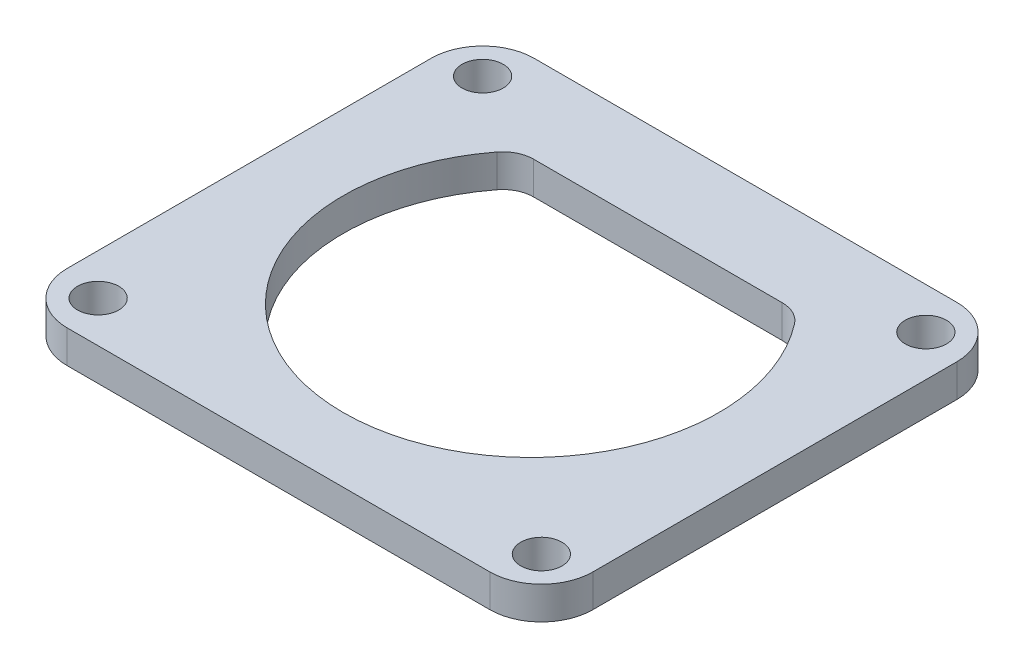
ISO-10303-21;
HEADER;
FILE_DESCRIPTION(('STEP AP214'),'2;1');
FILE_NAME('part.step','',(''),(''),'','','');
FILE_SCHEMA(('AUTOMOTIVE_DESIGN { 1 0 10303 214 1 1 1 1 }'));
ENDSEC;
DATA;
#1=APPLICATION_CONTEXT('core data for automotive mechanical design processes');
#2=APPLICATION_PROTOCOL_DEFINITION('international standard','automotive_design',2000,#1);
#3=PRODUCT_CONTEXT('',#1,'mechanical');
#4=PRODUCT('Part','Part','',(#3));
#5=PRODUCT_RELATED_PRODUCT_CATEGORY('part','',(#4));
#6=PRODUCT_DEFINITION_FORMATION('','',#4);
#7=PRODUCT_DEFINITION_CONTEXT('part definition',#1,'design');
#8=PRODUCT_DEFINITION('design','',#6,#7);
#9=PRODUCT_DEFINITION_SHAPE('','',#8);
#10=(LENGTH_UNIT() NAMED_UNIT(*) SI_UNIT(.MILLI.,.METRE.));
#11=(NAMED_UNIT(*) PLANE_ANGLE_UNIT() SI_UNIT($,.RADIAN.));
#12=(NAMED_UNIT(*) SI_UNIT($,.STERADIAN.) SOLID_ANGLE_UNIT());
#13=UNCERTAINTY_MEASURE_WITH_UNIT(LENGTH_MEASURE(1.E-05),#10,'distance_accuracy_value','');
#14=(GEOMETRIC_REPRESENTATION_CONTEXT(3) GLOBAL_UNCERTAINTY_ASSIGNED_CONTEXT((#13)) GLOBAL_UNIT_ASSIGNED_CONTEXT((#10,
#11,#12)) REPRESENTATION_CONTEXT('',''));
#15=CARTESIAN_POINT('',(0.,0.,0.));
#16=DIRECTION('',(0.,0.,1.));
#17=DIRECTION('',(1.,0.,0.));
#18=AXIS2_PLACEMENT_3D('',#15,#16,#17);
#19=CARTESIAN_POINT('',(-823.489347611488,375.510927831157,291.45));
#20=DIRECTION('',(0.,-1.,0.));
#21=DIRECTION('',(0.,0.,-1.));
#22=AXIS2_PLACEMENT_3D('',#19,#20,#21);
#23=PLANE('',#22);
#24=CARTESIAN_POINT('',(-782.489347611488,375.510927831157,363.05));
#25=DIRECTION('',(0.,1.,0.));
#26=DIRECTION('',(0.,0.,1.));
#27=AXIS2_PLACEMENT_3D('',#24,#25,#26);
#28=CIRCLE('',#27,10.);
#29=CARTESIAN_POINT('',(-772.489347611488,375.510927831157,363.05));
#30=VERTEX_POINT('',#29);
#31=CARTESIAN_POINT('',(-782.489347611488,375.510927831157,373.05));
#32=VERTEX_POINT('',#31);
#33=EDGE_CURVE('E196',#30,#32,#28,.F.);
#34=ORIENTED_EDGE('',*,*,#33,.F.);
#35=DIRECTION('',(0.,0.,1.));
#36=VECTOR('',#35,1.);
#37=CARTESIAN_POINT('',(-772.489347611488,375.510927831157,375.05));
#38=LINE('',#37,#36);
#39=CARTESIAN_POINT('',(-772.489347611488,375.510927831157,292.45));
#40=VERTEX_POINT('',#39);
#41=EDGE_CURVE('E135',#30,#40,#38,.F.);
#42=ORIENTED_EDGE('',*,*,#41,.T.);
#43=CARTESIAN_POINT('',(-782.489347611488,375.510927831157,292.45));
#44=DIRECTION('',(0.,-1.,0.));
#45=DIRECTION('',(0.,0.,-1.));
#46=AXIS2_PLACEMENT_3D('',#43,#44,#45);
#47=CIRCLE('',#46,10.);
#48=CARTESIAN_POINT('',(-782.489347611488,375.510927831157,282.45));
#49=VERTEX_POINT('',#48);
#50=EDGE_CURVE('E139',#49,#40,#47,.T.);
#51=ORIENTED_EDGE('',*,*,#50,.F.);
#52=DIRECTION('',(-1.,0.,0.));
#53=VECTOR('',#52,1.);
#54=CARTESIAN_POINT('',(-823.489347611488,375.510927831157,282.45));
#55=LINE('',#54,#53);
#56=CARTESIAN_POINT('',(-864.489347611488,375.510927831157,282.45));
#57=VERTEX_POINT('',#56);
#58=EDGE_CURVE('E145',#57,#49,#55,.F.);
#59=ORIENTED_EDGE('',*,*,#58,.F.);
#60=CARTESIAN_POINT('',(-864.489347611488,375.510927831157,292.45));
#61=DIRECTION('',(0.,1.,0.));
#62=DIRECTION('',(0.,0.,1.));
#63=AXIS2_PLACEMENT_3D('',#60,#61,#62);
#64=CIRCLE('',#63,10.);
#65=CARTESIAN_POINT('',(-874.489347611488,375.510927831157,292.45));
#66=VERTEX_POINT('',#65);
#67=EDGE_CURVE('E203',#66,#57,#64,.F.);
#68=ORIENTED_EDGE('',*,*,#67,.F.);
#69=DIRECTION('',(0.,0.,-1.));
#70=VECTOR('',#69,1.);
#71=CARTESIAN_POINT('',(-874.489347611488,375.510927831157,283.45));
#72=LINE('',#71,#70);
#73=CARTESIAN_POINT('',(-874.489347611488,375.510927831157,363.05));
#74=VERTEX_POINT('',#73);
#75=EDGE_CURVE('E150',#66,#74,#72,.F.);
#76=ORIENTED_EDGE('',*,*,#75,.T.);
#77=CARTESIAN_POINT('',(-864.489347611488,375.510927831157,363.05));
#78=DIRECTION('',(0.,-1.,0.));
#79=DIRECTION('',(0.,0.,-1.));
#80=AXIS2_PLACEMENT_3D('',#77,#78,#79);
#81=CIRCLE('',#80,10.);
#82=CARTESIAN_POINT('',(-864.489347611488,375.510927831157,373.05));
#83=VERTEX_POINT('',#82);
#84=EDGE_CURVE('E153',#83,#74,#81,.T.);
#85=ORIENTED_EDGE('',*,*,#84,.F.);
#86=DIRECTION('',(-1.,0.,0.));
#87=VECTOR('',#86,1.);
#88=CARTESIAN_POINT('',(-869.489347611488,375.510927831157,373.05));
#89=LINE('',#88,#87);
#90=EDGE_CURVE('E140',#83,#32,#89,.F.);
#91=ORIENTED_EDGE('',*,*,#90,.T.);
#92=EDGE_LOOP('',(#34,#42,#51,#59,#68,#76,#85,#91));
#93=FACE_BOUND('',#92,.T.);
#94=CARTESIAN_POINT('',(-866.489347611488,375.510927831157,365.05));
#95=DIRECTION('',(0.,-1.,0.));
#96=DIRECTION('',(0.,0.,-1.));
#97=AXIS2_PLACEMENT_3D('',#94,#95,#96);
#98=CIRCLE('',#97,4.);
#99=CARTESIAN_POINT('',(-866.489347611488,375.510927831157,361.05));
#100=VERTEX_POINT('',#99);
#101=EDGE_CURVE('E217',#100,#100,#98,.T.);
#102=ORIENTED_EDGE('',*,*,#101,.T.);
#103=EDGE_LOOP('',(#102));
#104=FACE_BOUND('',#103,.T.);
#105=CARTESIAN_POINT('',(-866.489347611488,375.510927831157,290.45));
#106=DIRECTION('',(0.,-1.,0.));
#107=DIRECTION('',(0.,0.,-1.));
#108=AXIS2_PLACEMENT_3D('',#105,#106,#107);
#109=CIRCLE('',#108,4.);
#110=CARTESIAN_POINT('',(-866.489347611488,375.510927831157,286.45));
#111=VERTEX_POINT('',#110);
#112=EDGE_CURVE('E221',#111,#111,#109,.T.);
#113=ORIENTED_EDGE('',*,*,#112,.T.);
#114=EDGE_LOOP('',(#113));
#115=FACE_BOUND('',#114,.T.);
#116=CARTESIAN_POINT('',(-780.489347611488,375.510927831157,365.05));
#117=DIRECTION('',(0.,-1.,0.));
#118=DIRECTION('',(0.,0.,-1.));
#119=AXIS2_PLACEMENT_3D('',#116,#117,#118);
#120=CIRCLE('',#119,4.);
#121=CARTESIAN_POINT('',(-780.489347611488,375.510927831157,361.05));
#122=VERTEX_POINT('',#121);
#123=EDGE_CURVE('E213',#122,#122,#120,.T.);
#124=ORIENTED_EDGE('',*,*,#123,.T.);
#125=EDGE_LOOP('',(#124));
#126=FACE_BOUND('',#125,.T.);
#127=CARTESIAN_POINT('',(-780.489347611488,375.510927831157,290.45));
#128=DIRECTION('',(0.,-1.,0.));
#129=DIRECTION('',(0.,0.,-1.));
#130=AXIS2_PLACEMENT_3D('',#127,#128,#129);
#131=CIRCLE('',#130,4.);
#132=CARTESIAN_POINT('',(-780.489347611488,375.510927831157,286.45));
#133=VERTEX_POINT('',#132);
#134=EDGE_CURVE('E144',#133,#133,#131,.T.);
#135=ORIENTED_EDGE('',*,*,#134,.T.);
#136=EDGE_LOOP('',(#135));
#137=FACE_BOUND('',#136,.T.);
#138=CARTESIAN_POINT('',(-847.597055943057,375.510927831157,305.45));
#139=DIRECTION('',(0.,1.,0.));
#140=DIRECTION('',(0.,0.,1.));
#141=AXIS2_PLACEMENT_3D('',#138,#139,#140);
#142=CIRCLE('',#141,6.);
#143=CARTESIAN_POINT('',(-852.347499307023,375.510927831157,301.784855003448));
#144=VERTEX_POINT('',#143);
#145=CARTESIAN_POINT('',(-847.597055943057,375.510927831157,299.45));
#146=VERTEX_POINT('',#145);
#147=EDGE_CURVE('E19',#144,#146,#142,.F.);
#148=ORIENTED_EDGE('',*,*,#147,.T.);
#149=DIRECTION('',(-1.,0.,0.));
#150=VECTOR('',#149,1.);
#151=CARTESIAN_POINT('',(-854.928096316012,375.510927831157,299.45));
#152=LINE('',#151,#150);
#153=CARTESIAN_POINT('',(-799.381639279919,375.510927831157,299.45));
#154=VERTEX_POINT('',#153);
#155=EDGE_CURVE('E106',#146,#154,#152,.F.);
#156=ORIENTED_EDGE('',*,*,#155,.T.);
#157=CARTESIAN_POINT('',(-799.381639279919,375.510927831157,305.45));
#158=DIRECTION('',(0.,1.,0.));
#159=DIRECTION('',(0.,0.,1.));
#160=AXIS2_PLACEMENT_3D('',#157,#158,#159);
#161=CIRCLE('',#160,6.);
#162=CARTESIAN_POINT('',(-794.631195915953,375.510927831157,301.784855003448));
#163=VERTEX_POINT('',#162);
#164=EDGE_CURVE('E225',#154,#163,#161,.F.);
#165=ORIENTED_EDGE('',*,*,#164,.T.);
#166=CARTESIAN_POINT('',(-823.489347611488,375.510927831157,324.05));
#167=DIRECTION('',(0.,1.,0.));
#168=DIRECTION('',(0.,0.,1.));
#169=AXIS2_PLACEMENT_3D('',#166,#167,#168);
#170=CIRCLE('',#169,36.449);
#171=EDGE_CURVE('E103',#163,#144,#170,.F.);
#172=ORIENTED_EDGE('',*,*,#171,.T.);
#173=EDGE_LOOP('',(#148,#156,#165,#172));
#174=FACE_BOUND('',#173,.T.);
#175=ADVANCED_FACE('F16',(#93,#104,#115,#126,#137,#174),#23,.F.);
#176=CARTESIAN_POINT('',(-854.928096316012,369.160927831157,299.45));
#177=DIRECTION('',(0.,0.,-1.));
#178=DIRECTION('',(-1.,0.,0.));
#179=AXIS2_PLACEMENT_3D('',#176,#177,#178);
#180=PLANE('',#179);
#181=ORIENTED_EDGE('',*,*,#155,.F.);
#182=DIRECTION('',(0.,1.,0.));
#183=VECTOR('',#182,1.);
#184=CARTESIAN_POINT('',(-847.597055943057,368.525925431157,299.45));
#185=LINE('',#184,#183);
#186=CARTESIAN_POINT('',(-847.597055943057,369.160927831157,299.45));
#187=VERTEX_POINT('',#186);
#188=EDGE_CURVE('E112',#146,#187,#185,.F.);
#189=ORIENTED_EDGE('',*,*,#188,.T.);
#190=DIRECTION('',(1.,0.,0.));
#191=VECTOR('',#190,1.);
#192=CARTESIAN_POINT('',(-823.489347611488,369.160927831157,299.45));
#193=LINE('',#192,#191);
#194=CARTESIAN_POINT('',(-799.381639279919,369.160927831157,299.45));
#195=VERTEX_POINT('',#194);
#196=EDGE_CURVE('E195',#195,#187,#193,.F.);
#197=ORIENTED_EDGE('',*,*,#196,.F.);
#198=DIRECTION('',(0.,1.,0.));
#199=VECTOR('',#198,1.);
#200=CARTESIAN_POINT('',(-799.381639279919,368.525925431157,299.45));
#201=LINE('',#200,#199);
#202=EDGE_CURVE('E117',#195,#154,#201,.T.);
#203=ORIENTED_EDGE('',*,*,#202,.T.);
#204=EDGE_LOOP('',(#181,#189,#197,#203));
#205=FACE_BOUND('',#204,.T.);
#206=ADVANCED_FACE('F114',(#205),#180,.F.);
#207=CARTESIAN_POINT('',(-847.597055943057,368.525925431157,305.45));
#208=DIRECTION('',(0.,1.,0.));
#209=DIRECTION('',(0.,0.,1.));
#210=AXIS2_PLACEMENT_3D('',#207,#208,#209);
#211=CYLINDRICAL_SURFACE('',#210,6.);
#212=CARTESIAN_POINT('',(-847.597055943057,369.160927831157,305.45));
#213=DIRECTION('',(0.,1.,0.));
#214=DIRECTION('',(0.,0.,1.));
#215=AXIS2_PLACEMENT_3D('',#212,#213,#214);
#216=CIRCLE('',#215,6.);
#217=CARTESIAN_POINT('',(-852.347499307023,369.160927831157,301.784855003448));
#218=VERTEX_POINT('',#217);
#219=EDGE_CURVE('E123',#187,#218,#216,.T.);
#220=ORIENTED_EDGE('',*,*,#219,.F.);
#221=ORIENTED_EDGE('',*,*,#188,.F.);
#222=ORIENTED_EDGE('',*,*,#147,.F.);
#223=DIRECTION('',(0.,1.,0.));
#224=VECTOR('',#223,1.);
#225=CARTESIAN_POINT('',(-852.347499307023,368.525925431157,301.784855003448));
#226=LINE('',#225,#224);
#227=EDGE_CURVE('E131',#144,#218,#226,.F.);
#228=ORIENTED_EDGE('',*,*,#227,.T.);
#229=EDGE_LOOP('',(#220,#221,#222,#228));
#230=FACE_BOUND('',#229,.T.);
#231=ADVANCED_FACE('F121',(#230),#211,.F.);
#232=CARTESIAN_POINT('',(-823.489347611488,368.525925431157,324.05));
#233=DIRECTION('',(0.,1.,0.));
#234=DIRECTION('',(0.,0.,1.));
#235=AXIS2_PLACEMENT_3D('',#232,#233,#234);
#236=CYLINDRICAL_SURFACE('',#235,36.449);
#237=ORIENTED_EDGE('',*,*,#171,.F.);
#238=DIRECTION('',(0.,1.,0.));
#239=VECTOR('',#238,1.);
#240=CARTESIAN_POINT('',(-794.631195915953,368.525925431157,301.784855003448));
#241=LINE('',#240,#239);
#242=CARTESIAN_POINT('',(-794.631195915953,369.160927831157,301.784855003448));
#243=VERTEX_POINT('',#242);
#244=EDGE_CURVE('E227',#163,#243,#241,.F.);
#245=ORIENTED_EDGE('',*,*,#244,.T.);
#246=CARTESIAN_POINT('',(-823.489347611488,369.160927831157,324.05));
#247=DIRECTION('',(0.,1.,0.));
#248=DIRECTION('',(0.,0.,1.));
#249=AXIS2_PLACEMENT_3D('',#246,#247,#248);
#250=CIRCLE('',#249,36.449);
#251=EDGE_CURVE('E189',#218,#243,#250,.T.);
#252=ORIENTED_EDGE('',*,*,#251,.F.);
#253=ORIENTED_EDGE('',*,*,#227,.F.);
#254=EDGE_LOOP('',(#237,#245,#252,#253));
#255=FACE_BOUND('',#254,.T.);
#256=ADVANCED_FACE('F234',(#255),#236,.F.);
#257=CARTESIAN_POINT('',(-799.381639279919,368.525925431157,305.45));
#258=DIRECTION('',(0.,1.,0.));
#259=DIRECTION('',(0.,0.,1.));
#260=AXIS2_PLACEMENT_3D('',#257,#258,#259);
#261=CYLINDRICAL_SURFACE('',#260,6.);
#262=CARTESIAN_POINT('',(-799.381639279919,369.160927831157,305.45));
#263=DIRECTION('',(0.,1.,0.));
#264=DIRECTION('',(0.,0.,1.));
#265=AXIS2_PLACEMENT_3D('',#262,#263,#264);
#266=CIRCLE('',#265,6.);
#267=EDGE_CURVE('E185',#243,#195,#266,.T.);
#268=ORIENTED_EDGE('',*,*,#267,.F.);
#269=ORIENTED_EDGE('',*,*,#244,.F.);
#270=ORIENTED_EDGE('',*,*,#164,.F.);
#271=ORIENTED_EDGE('',*,*,#202,.F.);
#272=EDGE_LOOP('',(#268,#269,#270,#271));
#273=FACE_BOUND('',#272,.T.);
#274=ADVANCED_FACE('F403',(#273),#261,.F.);
#275=CARTESIAN_POINT('',(-866.489347611488,376.145930231157,290.45));
#276=DIRECTION('',(0.,-1.,0.));
#277=DIRECTION('',(0.,0.,-1.));
#278=AXIS2_PLACEMENT_3D('',#275,#276,#277);
#279=CYLINDRICAL_SURFACE('',#278,4.);
#280=CARTESIAN_POINT('',(-866.489347611488,369.160927831157,290.45));
#281=DIRECTION('',(0.,-1.,0.));
#282=DIRECTION('',(0.,0.,-1.));
#283=AXIS2_PLACEMENT_3D('',#280,#281,#282);
#284=CIRCLE('',#283,4.);
#285=CARTESIAN_POINT('',(-866.489347611488,369.160927831157,286.45));
#286=VERTEX_POINT('',#285);
#287=EDGE_CURVE('E181',#286,#286,#284,.F.);
#288=ORIENTED_EDGE('',*,*,#287,.F.);
#289=EDGE_LOOP('',(#288));
#290=FACE_BOUND('',#289,.T.);
#291=ORIENTED_EDGE('',*,*,#112,.F.);
#292=EDGE_LOOP('',(#291));
#293=FACE_BOUND('',#292,.T.);
#294=ADVANCED_FACE('F394',(#290,#293),#279,.F.);
#295=CARTESIAN_POINT('',(-866.489347611488,376.145930231157,365.05));
#296=DIRECTION('',(0.,-1.,0.));
#297=DIRECTION('',(0.,0.,-1.));
#298=AXIS2_PLACEMENT_3D('',#295,#296,#297);
#299=CYLINDRICAL_SURFACE('',#298,4.);
#300=CARTESIAN_POINT('',(-866.489347611488,369.160927831157,365.05));
#301=DIRECTION('',(0.,-1.,0.));
#302=DIRECTION('',(0.,0.,-1.));
#303=AXIS2_PLACEMENT_3D('',#300,#301,#302);
#304=CIRCLE('',#303,4.);
#305=CARTESIAN_POINT('',(-866.489347611488,369.160927831157,361.05));
#306=VERTEX_POINT('',#305);
#307=EDGE_CURVE('E177',#306,#306,#304,.F.);
#308=ORIENTED_EDGE('',*,*,#307,.F.);
#309=EDGE_LOOP('',(#308));
#310=FACE_BOUND('',#309,.T.);
#311=ORIENTED_EDGE('',*,*,#101,.F.);
#312=EDGE_LOOP('',(#311));
#313=FACE_BOUND('',#312,.T.);
#314=ADVANCED_FACE('F385',(#310,#313),#299,.F.);
#315=CARTESIAN_POINT('',(-780.489347611488,376.145930231157,365.05));
#316=DIRECTION('',(0.,-1.,0.));
#317=DIRECTION('',(0.,0.,-1.));
#318=AXIS2_PLACEMENT_3D('',#315,#316,#317);
#319=CYLINDRICAL_SURFACE('',#318,4.);
#320=CARTESIAN_POINT('',(-780.489347611488,369.160927831157,365.05));
#321=DIRECTION('',(0.,-1.,0.));
#322=DIRECTION('',(0.,0.,-1.));
#323=AXIS2_PLACEMENT_3D('',#320,#321,#322);
#324=CIRCLE('',#323,4.);
#325=CARTESIAN_POINT('',(-780.489347611488,369.160927831157,361.05));
#326=VERTEX_POINT('',#325);
#327=EDGE_CURVE('E173',#326,#326,#324,.F.);
#328=ORIENTED_EDGE('',*,*,#327,.F.);
#329=EDGE_LOOP('',(#328));
#330=FACE_BOUND('',#329,.T.);
#331=ORIENTED_EDGE('',*,*,#123,.F.);
#332=EDGE_LOOP('',(#331));
#333=FACE_BOUND('',#332,.T.);
#334=ADVANCED_FACE('F376',(#330,#333),#319,.F.);
#335=CARTESIAN_POINT('',(-780.489347611488,376.145930231157,290.45));
#336=DIRECTION('',(0.,-1.,0.));
#337=DIRECTION('',(0.,0.,-1.));
#338=AXIS2_PLACEMENT_3D('',#335,#336,#337);
#339=CYLINDRICAL_SURFACE('',#338,4.);
#340=CARTESIAN_POINT('',(-780.489347611488,369.160927831157,290.45));
#341=DIRECTION('',(0.,-1.,0.));
#342=DIRECTION('',(0.,0.,-1.));
#343=AXIS2_PLACEMENT_3D('',#340,#341,#342);
#344=CIRCLE('',#343,4.);
#345=CARTESIAN_POINT('',(-780.489347611488,369.160927831157,286.45));
#346=VERTEX_POINT('',#345);
#347=EDGE_CURVE('E169',#346,#346,#344,.F.);
#348=ORIENTED_EDGE('',*,*,#347,.F.);
#349=EDGE_LOOP('',(#348));
#350=FACE_BOUND('',#349,.T.);
#351=ORIENTED_EDGE('',*,*,#134,.F.);
#352=EDGE_LOOP('',(#351));
#353=FACE_BOUND('',#352,.T.);
#354=ADVANCED_FACE('F367',(#350,#353),#339,.F.);
#355=CARTESIAN_POINT('',(-869.489347611488,355.510927831157,373.05));
#356=DIRECTION('',(0.,0.,-1.));
#357=DIRECTION('',(-1.,0.,0.));
#358=AXIS2_PLACEMENT_3D('',#355,#356,#357);
#359=PLANE('',#358);
#360=DIRECTION('',(1.,0.,0.));
#361=VECTOR('',#360,1.);
#362=CARTESIAN_POINT('',(-823.489347611488,369.160927831157,373.05));
#363=LINE('',#362,#361);
#364=CARTESIAN_POINT('',(-782.489347611488,369.160927831157,373.05));
#365=VERTEX_POINT('',#364);
#366=CARTESIAN_POINT('',(-864.489347611488,369.160927831157,373.05));
#367=VERTEX_POINT('',#366);
#368=EDGE_CURVE('E168',#365,#367,#363,.F.);
#369=ORIENTED_EDGE('',*,*,#368,.F.);
#370=DIRECTION('',(0.,1.,0.));
#371=VECTOR('',#370,1.);
#372=CARTESIAN_POINT('',(-782.489347611488,372.335927831157,373.05));
#373=LINE('',#372,#371);
#374=EDGE_CURVE('E245',#32,#365,#373,.F.);
#375=ORIENTED_EDGE('',*,*,#374,.F.);
#376=ORIENTED_EDGE('',*,*,#90,.F.);
#377=DIRECTION('',(0.,-1.,0.));
#378=VECTOR('',#377,1.);
#379=CARTESIAN_POINT('',(-864.489347611488,372.335927831157,373.05));
#380=LINE('',#379,#378);
#381=EDGE_CURVE('E143',#367,#83,#380,.F.);
#382=ORIENTED_EDGE('',*,*,#381,.F.);
#383=EDGE_LOOP('',(#369,#375,#376,#382));
#384=FACE_BOUND('',#383,.T.);
#385=ADVANCED_FACE('F358',(#384),#359,.F.);
#386=CARTESIAN_POINT('',(-864.489347611488,372.335927831157,363.05));
#387=DIRECTION('',(0.,-1.,0.));
#388=DIRECTION('',(0.,0.,-1.));
#389=AXIS2_PLACEMENT_3D('',#386,#387,#388);
#390=CYLINDRICAL_SURFACE('',#389,10.);
#391=DIRECTION('',(0.,1.,0.));
#392=VECTOR('',#391,1.);
#393=CARTESIAN_POINT('',(-874.489347611488,355.510927831157,363.05));
#394=LINE('',#393,#392);
#395=CARTESIAN_POINT('',(-874.489347611488,369.160927831157,363.05));
#396=VERTEX_POINT('',#395);
#397=EDGE_CURVE('E152',#74,#396,#394,.F.);
#398=ORIENTED_EDGE('',*,*,#397,.T.);
#399=CARTESIAN_POINT('',(-864.489347611488,369.160927831157,363.05));
#400=DIRECTION('',(0.,-1.,0.));
#401=DIRECTION('',(0.,0.,-1.));
#402=AXIS2_PLACEMENT_3D('',#399,#400,#401);
#403=CIRCLE('',#402,10.);
#404=EDGE_CURVE('E164',#367,#396,#403,.T.);
#405=ORIENTED_EDGE('',*,*,#404,.F.);
#406=ORIENTED_EDGE('',*,*,#381,.T.);
#407=ORIENTED_EDGE('',*,*,#84,.T.);
#408=EDGE_LOOP('',(#398,#405,#406,#407));
#409=FACE_BOUND('',#408,.T.);
#410=ADVANCED_FACE('F350',(#409),#390,.T.);
#411=CARTESIAN_POINT('',(-874.489347611488,355.510927831157,283.45));
#412=DIRECTION('',(1.,0.,0.));
#413=DIRECTION('',(0.,0.,-1.));
#414=AXIS2_PLACEMENT_3D('',#411,#412,#413);
#415=PLANE('',#414);
#416=ORIENTED_EDGE('',*,*,#75,.F.);
#417=DIRECTION('',(0.,1.,0.));
#418=VECTOR('',#417,1.);
#419=CARTESIAN_POINT('',(-874.489347611488,375.510927831157,292.45));
#420=LINE('',#419,#418);
#421=CARTESIAN_POINT('',(-874.489347611488,369.160927831157,292.45));
#422=VERTEX_POINT('',#421);
#423=EDGE_CURVE('E206',#422,#66,#420,.T.);
#424=ORIENTED_EDGE('',*,*,#423,.F.);
#425=DIRECTION('',(0.,0.,-1.));
#426=VECTOR('',#425,1.);
#427=CARTESIAN_POINT('',(-874.489347611488,369.160927831157,291.45));
#428=LINE('',#427,#426);
#429=EDGE_CURVE('E163',#396,#422,#428,.T.);
#430=ORIENTED_EDGE('',*,*,#429,.F.);
#431=ORIENTED_EDGE('',*,*,#397,.F.);
#432=EDGE_LOOP('',(#416,#424,#430,#431));
#433=FACE_BOUND('',#432,.T.);
#434=ADVANCED_FACE('F283',(#433),#415,.F.);
#435=CARTESIAN_POINT('',(-864.489347611488,375.510927831157,292.45));
#436=DIRECTION('',(0.,1.,0.));
#437=DIRECTION('',(0.,0.,1.));
#438=AXIS2_PLACEMENT_3D('',#435,#436,#437);
#439=CYLINDRICAL_SURFACE('',#438,10.);
#440=DIRECTION('',(0.,1.,0.));
#441=VECTOR('',#440,1.);
#442=CARTESIAN_POINT('',(-864.489347611488,420.210927831157,282.45));
#443=LINE('',#442,#441);
#444=CARTESIAN_POINT('',(-864.489347611488,369.160927831157,282.45));
#445=VERTEX_POINT('',#444);
#446=EDGE_CURVE('E149',#445,#57,#443,.T.);
#447=ORIENTED_EDGE('',*,*,#446,.F.);
#448=CARTESIAN_POINT('',(-864.489347611488,369.160927831157,292.45));
#449=DIRECTION('',(0.,1.,0.));
#450=DIRECTION('',(0.,0.,1.));
#451=AXIS2_PLACEMENT_3D('',#448,#449,#450);
#452=CIRCLE('',#451,10.);
#453=EDGE_CURVE('E160',#422,#445,#452,.F.);
#454=ORIENTED_EDGE('',*,*,#453,.F.);
#455=ORIENTED_EDGE('',*,*,#423,.T.);
#456=ORIENTED_EDGE('',*,*,#67,.T.);
#457=EDGE_LOOP('',(#447,#454,#455,#456));
#458=FACE_BOUND('',#457,.T.);
#459=ADVANCED_FACE('F286',(#458),#439,.T.);
#460=CARTESIAN_POINT('',(-823.489347611488,420.210927831157,282.45));
#461=DIRECTION('',(0.,0.,-1.));
#462=DIRECTION('',(-1.,0.,0.));
#463=AXIS2_PLACEMENT_3D('',#460,#461,#462);
#464=PLANE('',#463);
#465=DIRECTION('',(0.,-1.,0.));
#466=VECTOR('',#465,1.);
#467=CARTESIAN_POINT('',(-782.489347611488,375.510927831157,282.45));
#468=LINE('',#467,#466);
#469=CARTESIAN_POINT('',(-782.489347611488,369.160927831157,282.45));
#470=VERTEX_POINT('',#469);
#471=EDGE_CURVE('E148',#470,#49,#468,.F.);
#472=ORIENTED_EDGE('',*,*,#471,.F.);
#473=DIRECTION('',(1.,0.,0.));
#474=VECTOR('',#473,1.);
#475=CARTESIAN_POINT('',(-823.489347611488,369.160927831157,282.45));
#476=LINE('',#475,#474);
#477=EDGE_CURVE('E159',#445,#470,#476,.T.);
#478=ORIENTED_EDGE('',*,*,#477,.F.);
#479=ORIENTED_EDGE('',*,*,#446,.T.);
#480=ORIENTED_EDGE('',*,*,#58,.T.);
#481=EDGE_LOOP('',(#472,#478,#479,#480));
#482=FACE_BOUND('',#481,.T.);
#483=ADVANCED_FACE('F290',(#482),#464,.T.);
#484=CARTESIAN_POINT('',(-782.489347611488,375.510927831157,292.45));
#485=DIRECTION('',(0.,-1.,0.));
#486=DIRECTION('',(0.,0.,-1.));
#487=AXIS2_PLACEMENT_3D('',#484,#485,#486);
#488=CYLINDRICAL_SURFACE('',#487,10.);
#489=ORIENTED_EDGE('',*,*,#471,.T.);
#490=ORIENTED_EDGE('',*,*,#50,.T.);
#491=DIRECTION('',(0.,1.,0.));
#492=VECTOR('',#491,1.);
#493=CARTESIAN_POINT('',(-772.489347611488,355.510927831157,292.45));
#494=LINE('',#493,#492);
#495=CARTESIAN_POINT('',(-772.489347611488,369.160927831157,292.45));
#496=VERTEX_POINT('',#495);
#497=EDGE_CURVE('E138',#40,#496,#494,.F.);
#498=ORIENTED_EDGE('',*,*,#497,.T.);
#499=CARTESIAN_POINT('',(-782.489347611488,369.160927831157,292.45));
#500=DIRECTION('',(0.,-1.,0.));
#501=DIRECTION('',(0.,0.,-1.));
#502=AXIS2_PLACEMENT_3D('',#499,#500,#501);
#503=CIRCLE('',#502,10.);
#504=EDGE_CURVE('E155',#470,#496,#503,.T.);
#505=ORIENTED_EDGE('',*,*,#504,.F.);
#506=EDGE_LOOP('',(#489,#490,#498,#505));
#507=FACE_BOUND('',#506,.T.);
#508=ADVANCED_FACE('F293',(#507),#488,.T.);
#509=CARTESIAN_POINT('',(-772.489347611488,355.510927831157,375.05));
#510=DIRECTION('',(-1.,0.,0.));
#511=DIRECTION('',(0.,0.,1.));
#512=AXIS2_PLACEMENT_3D('',#509,#510,#511);
#513=PLANE('',#512);
#514=DIRECTION('',(0.,0.,-1.));
#515=VECTOR('',#514,1.);
#516=CARTESIAN_POINT('',(-772.489347611488,369.160927831157,291.45));
#517=LINE('',#516,#515);
#518=CARTESIAN_POINT('',(-772.489347611488,369.160927831157,363.05));
#519=VERTEX_POINT('',#518);
#520=EDGE_CURVE('E26',#496,#519,#517,.F.);
#521=ORIENTED_EDGE('',*,*,#520,.F.);
#522=ORIENTED_EDGE('',*,*,#497,.F.);
#523=ORIENTED_EDGE('',*,*,#41,.F.);
#524=DIRECTION('',(0.,1.,0.));
#525=VECTOR('',#524,1.);
#526=CARTESIAN_POINT('',(-772.489347611488,372.335927831157,363.05));
#527=LINE('',#526,#525);
#528=EDGE_CURVE('E35',#519,#30,#527,.T.);
#529=ORIENTED_EDGE('',*,*,#528,.F.);
#530=EDGE_LOOP('',(#521,#522,#523,#529));
#531=FACE_BOUND('',#530,.T.);
#532=ADVANCED_FACE('F296',(#531),#513,.F.);
#533=CARTESIAN_POINT('',(-782.489347611488,372.335927831157,363.05));
#534=DIRECTION('',(0.,1.,0.));
#535=DIRECTION('',(0.,0.,1.));
#536=AXIS2_PLACEMENT_3D('',#533,#534,#535);
#537=CYLINDRICAL_SURFACE('',#536,10.);
#538=ORIENTED_EDGE('',*,*,#528,.T.);
#539=ORIENTED_EDGE('',*,*,#33,.T.);
#540=ORIENTED_EDGE('',*,*,#374,.T.);
#541=CARTESIAN_POINT('',(-782.489347611488,369.160927831157,363.05));
#542=DIRECTION('',(0.,1.,0.));
#543=DIRECTION('',(0.,0.,1.));
#544=AXIS2_PLACEMENT_3D('',#541,#542,#543);
#545=CIRCLE('',#544,10.);
#546=EDGE_CURVE('E11',#519,#365,#545,.F.);
#547=ORIENTED_EDGE('',*,*,#546,.F.);
#548=EDGE_LOOP('',(#538,#539,#540,#547));
#549=FACE_BOUND('',#548,.T.);
#550=ADVANCED_FACE('F298',(#549),#537,.T.);
#551=CARTESIAN_POINT('',(-823.489347611488,369.160927831157,291.45));
#552=DIRECTION('',(0.,-1.,0.));
#553=DIRECTION('',(0.,0.,-1.));
#554=AXIS2_PLACEMENT_3D('',#551,#552,#553);
#555=PLANE('',#554);
#556=ORIENTED_EDGE('',*,*,#520,.T.);
#557=ORIENTED_EDGE('',*,*,#546,.T.);
#558=ORIENTED_EDGE('',*,*,#368,.T.);
#559=ORIENTED_EDGE('',*,*,#404,.T.);
#560=ORIENTED_EDGE('',*,*,#429,.T.);
#561=ORIENTED_EDGE('',*,*,#453,.T.);
#562=ORIENTED_EDGE('',*,*,#477,.T.);
#563=ORIENTED_EDGE('',*,*,#504,.T.);
#564=EDGE_LOOP('',(#556,#557,#558,#559,#560,#561,#562,#563));
#565=FACE_BOUND('',#564,.T.);
#566=ORIENTED_EDGE('',*,*,#347,.T.);
#567=EDGE_LOOP('',(#566));
#568=FACE_BOUND('',#567,.T.);
#569=ORIENTED_EDGE('',*,*,#327,.T.);
#570=EDGE_LOOP('',(#569));
#571=FACE_BOUND('',#570,.T.);
#572=ORIENTED_EDGE('',*,*,#307,.T.);
#573=EDGE_LOOP('',(#572));
#574=FACE_BOUND('',#573,.T.);
#575=ORIENTED_EDGE('',*,*,#287,.T.);
#576=EDGE_LOOP('',(#575));
#577=FACE_BOUND('',#576,.T.);
#578=ORIENTED_EDGE('',*,*,#251,.T.);
#579=ORIENTED_EDGE('',*,*,#267,.T.);
#580=ORIENTED_EDGE('',*,*,#196,.T.);
#581=ORIENTED_EDGE('',*,*,#219,.T.);
#582=EDGE_LOOP('',(#578,#579,#580,#581));
#583=FACE_BOUND('',#582,.T.);
#584=ADVANCED_FACE('F238',(#565,#568,#571,#574,#577,#583),#555,.T.);
#585=CLOSED_SHELL('',(#175,#206,#231,#256,#274,#294,#314,#334,#354,#385,#410,#434,#459,#483,
#508,#532,#550,#584));
#586=MANIFOLD_SOLID_BREP('B1',#585);
#587=ADVANCED_BREP_SHAPE_REPRESENTATION('',(#18,#586),#14);
#588=SHAPE_DEFINITION_REPRESENTATION(#9,#587);
ENDSEC;
END-ISO-10303-21;
